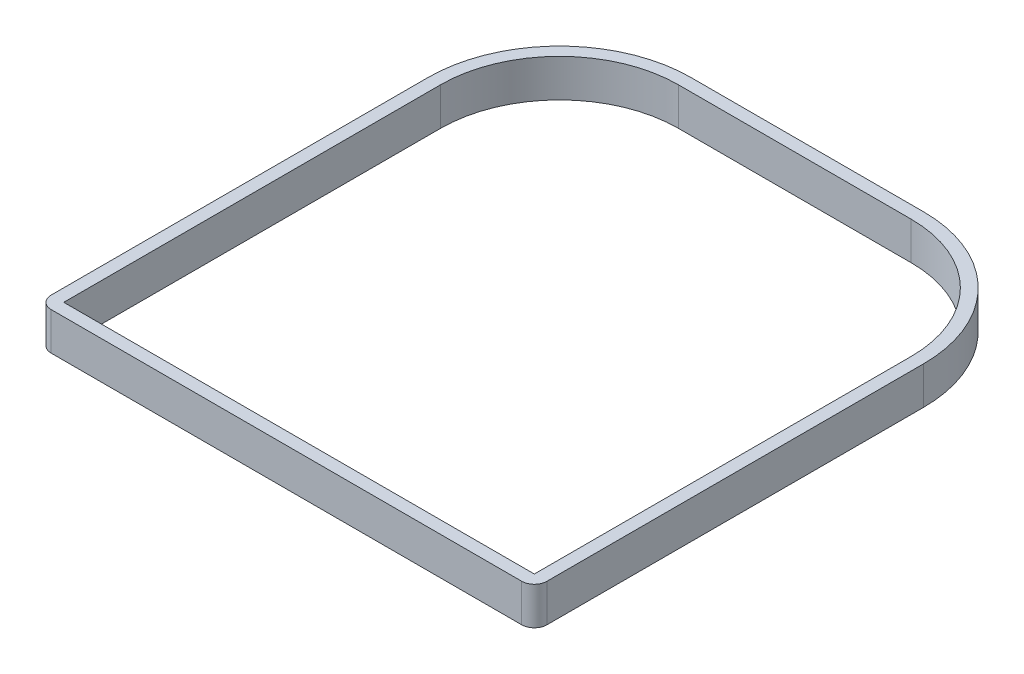
ISO-10303-21;
HEADER;
FILE_DESCRIPTION(('STEP AP214'),'2;1');
FILE_NAME('part.step','',(''),(''),'','','');
FILE_SCHEMA(('AUTOMOTIVE_DESIGN { 1 0 10303 214 1 1 1 1 }'));
ENDSEC;
DATA;
#1=APPLICATION_CONTEXT('core data for automotive mechanical design processes');
#2=APPLICATION_PROTOCOL_DEFINITION('international standard','automotive_design',2000,#1);
#3=PRODUCT_CONTEXT('',#1,'mechanical');
#4=PRODUCT('Part','Part','',(#3));
#5=PRODUCT_RELATED_PRODUCT_CATEGORY('part','',(#4));
#6=PRODUCT_DEFINITION_FORMATION('','',#4);
#7=PRODUCT_DEFINITION_CONTEXT('part definition',#1,'design');
#8=PRODUCT_DEFINITION('design','',#6,#7);
#9=PRODUCT_DEFINITION_SHAPE('','',#8);
#10=(LENGTH_UNIT() NAMED_UNIT(*) SI_UNIT(.MILLI.,.METRE.));
#11=(NAMED_UNIT(*) PLANE_ANGLE_UNIT() SI_UNIT($,.RADIAN.));
#12=(NAMED_UNIT(*) SI_UNIT($,.STERADIAN.) SOLID_ANGLE_UNIT());
#13=UNCERTAINTY_MEASURE_WITH_UNIT(LENGTH_MEASURE(1.E-05),#10,'distance_accuracy_value','');
#14=(GEOMETRIC_REPRESENTATION_CONTEXT(3) GLOBAL_UNCERTAINTY_ASSIGNED_CONTEXT((#13)) GLOBAL_UNIT_ASSIGNED_CONTEXT((#10,
#11,#12)) REPRESENTATION_CONTEXT('',''));
#15=CARTESIAN_POINT('',(0.,0.,0.));
#16=DIRECTION('',(0.,0.,1.));
#17=DIRECTION('',(1.,0.,0.));
#18=AXIS2_PLACEMENT_3D('',#15,#16,#17);
#19=CARTESIAN_POINT('',(-9.25,1.5,-9.25));
#20=DIRECTION('',(0.,1.,0.));
#21=DIRECTION('',(0.,0.,1.));
#22=AXIS2_PLACEMENT_3D('',#19,#20,#21);
#23=PLANE('',#22);
#24=DIRECTION('',(1.,0.,0.));
#25=VECTOR('',#24,1.);
#26=CARTESIAN_POINT('',(-19.7,1.5,21.7));
#27=LINE('',#26,#25);
#28=CARTESIAN_POINT('',(-18.7,1.5,21.7));
#29=VERTEX_POINT('',#28);
#30=CARTESIAN_POINT('',(18.7,1.5,21.7));
#31=VERTEX_POINT('',#30);
#32=EDGE_CURVE('E205',#29,#31,#27,.T.);
#33=ORIENTED_EDGE('',*,*,#32,.T.);
#34=CARTESIAN_POINT('',(18.7,1.5,20.7));
#35=DIRECTION('',(0.,1.,0.));
#36=DIRECTION('',(0.,0.,1.));
#37=AXIS2_PLACEMENT_3D('',#34,#35,#36);
#38=CIRCLE('',#37,1.);
#39=CARTESIAN_POINT('',(19.7,1.5,20.7));
#40=VERTEX_POINT('',#39);
#41=EDGE_CURVE('E48',#31,#40,#38,.T.);
#42=ORIENTED_EDGE('',*,*,#41,.T.);
#43=DIRECTION('',(0.,0.,-1.));
#44=VECTOR('',#43,1.);
#45=CARTESIAN_POINT('',(19.7,1.5,-9.25));
#46=LINE('',#45,#44);
#47=CARTESIAN_POINT('',(19.7,1.5,-9.25));
#48=VERTEX_POINT('',#47);
#49=EDGE_CURVE('E207',#40,#48,#46,.T.);
#50=ORIENTED_EDGE('',*,*,#49,.T.);
#51=CARTESIAN_POINT('',(9.25,1.5,-9.25));
#52=DIRECTION('',(0.,1.,0.));
#53=DIRECTION('',(0.,0.,1.));
#54=AXIS2_PLACEMENT_3D('',#51,#52,#53);
#55=CIRCLE('',#54,10.45);
#56=CARTESIAN_POINT('',(9.25,1.5,-19.7));
#57=VERTEX_POINT('',#56);
#58=EDGE_CURVE('E209',#48,#57,#55,.T.);
#59=ORIENTED_EDGE('',*,*,#58,.T.);
#60=DIRECTION('',(-1.,0.,0.));
#61=VECTOR('',#60,1.);
#62=CARTESIAN_POINT('',(-9.25,1.5,-19.7));
#63=LINE('',#62,#61);
#64=CARTESIAN_POINT('',(-9.25,1.5,-19.7));
#65=VERTEX_POINT('',#64);
#66=EDGE_CURVE('E211',#57,#65,#63,.T.);
#67=ORIENTED_EDGE('',*,*,#66,.T.);
#68=CARTESIAN_POINT('',(-9.25,1.5,-9.25));
#69=DIRECTION('',(0.,1.,0.));
#70=DIRECTION('',(0.,0.,1.));
#71=AXIS2_PLACEMENT_3D('',#68,#69,#70);
#72=CIRCLE('',#71,10.45);
#73=CARTESIAN_POINT('',(-19.7,1.5,-9.25));
#74=VERTEX_POINT('',#73);
#75=EDGE_CURVE('E199',#65,#74,#72,.T.);
#76=ORIENTED_EDGE('',*,*,#75,.T.);
#77=DIRECTION('',(0.,0.,1.));
#78=VECTOR('',#77,1.);
#79=CARTESIAN_POINT('',(-19.7,1.5,-9.25));
#80=LINE('',#79,#78);
#81=CARTESIAN_POINT('',(-19.7,1.5,20.7));
#82=VERTEX_POINT('',#81);
#83=EDGE_CURVE('E202',#74,#82,#80,.T.);
#84=ORIENTED_EDGE('',*,*,#83,.T.);
#85=CARTESIAN_POINT('',(-18.7,1.5,20.7));
#86=DIRECTION('',(0.,1.,0.));
#87=DIRECTION('',(0.,0.,1.));
#88=AXIS2_PLACEMENT_3D('',#85,#86,#87);
#89=CIRCLE('',#88,1.);
#90=EDGE_CURVE('E247',#82,#29,#89,.T.);
#91=ORIENTED_EDGE('',*,*,#90,.T.);
#92=EDGE_LOOP('',(#33,#42,#50,#59,#67,#76,#84,#91));
#93=FACE_BOUND('',#92,.T.);
#94=DIRECTION('',(0.,0.,1.));
#95=VECTOR('',#94,1.);
#96=CARTESIAN_POINT('',(-18.7,1.5,-9.25));
#97=LINE('',#96,#95);
#98=CARTESIAN_POINT('',(-18.7,1.5,-9.25));
#99=VERTEX_POINT('',#98);
#100=CARTESIAN_POINT('',(-18.7,1.5,20.7));
#101=VERTEX_POINT('',#100);
#102=EDGE_CURVE('E153',#99,#101,#97,.T.);
#103=ORIENTED_EDGE('',*,*,#102,.F.);
#104=CARTESIAN_POINT('',(-9.25,1.5,-9.25));
#105=DIRECTION('',(0.,1.,0.));
#106=DIRECTION('',(0.,0.,1.));
#107=AXIS2_PLACEMENT_3D('',#104,#105,#106);
#108=CIRCLE('',#107,9.45);
#109=CARTESIAN_POINT('',(-9.25,1.5,-18.7));
#110=VERTEX_POINT('',#109);
#111=EDGE_CURVE('E143',#110,#99,#108,.T.);
#112=ORIENTED_EDGE('',*,*,#111,.F.);
#113=DIRECTION('',(-1.,0.,0.));
#114=VECTOR('',#113,1.);
#115=CARTESIAN_POINT('',(-9.25,1.5,-18.7));
#116=LINE('',#115,#114);
#117=CARTESIAN_POINT('',(9.25,1.5,-18.7));
#118=VERTEX_POINT('',#117);
#119=EDGE_CURVE('E175',#118,#110,#116,.T.);
#120=ORIENTED_EDGE('',*,*,#119,.F.);
#121=CARTESIAN_POINT('',(9.25,1.5,-9.25));
#122=DIRECTION('',(0.,1.,0.));
#123=DIRECTION('',(0.,0.,1.));
#124=AXIS2_PLACEMENT_3D('',#121,#122,#123);
#125=CIRCLE('',#124,9.45);
#126=CARTESIAN_POINT('',(18.7,1.5,-9.25));
#127=VERTEX_POINT('',#126);
#128=EDGE_CURVE('E172',#127,#118,#125,.T.);
#129=ORIENTED_EDGE('',*,*,#128,.F.);
#130=DIRECTION('',(0.,0.,-1.));
#131=VECTOR('',#130,1.);
#132=CARTESIAN_POINT('',(18.7,1.5,-9.25));
#133=LINE('',#132,#131);
#134=CARTESIAN_POINT('',(18.7,1.5,20.7));
#135=VERTEX_POINT('',#134);
#136=EDGE_CURVE('E168',#135,#127,#133,.T.);
#137=ORIENTED_EDGE('',*,*,#136,.F.);
#138=DIRECTION('',(1.,0.,0.));
#139=VECTOR('',#138,1.);
#140=CARTESIAN_POINT('',(-18.7,1.5,20.7));
#141=LINE('',#140,#139);
#142=EDGE_CURVE('E166',#101,#135,#141,.T.);
#143=ORIENTED_EDGE('',*,*,#142,.F.);
#144=EDGE_LOOP('',(#103,#112,#120,#129,#137,#143));
#145=FACE_BOUND('',#144,.T.);
#146=ADVANCED_FACE('F40',(#93,#145),#23,.T.);
#147=CARTESIAN_POINT('',(-9.25,-1.5,-9.25));
#148=DIRECTION('',(0.,1.,0.));
#149=DIRECTION('',(0.,0.,1.));
#150=AXIS2_PLACEMENT_3D('',#147,#148,#149);
#151=PLANE('',#150);
#152=DIRECTION('',(0.,0.,-1.));
#153=VECTOR('',#152,1.);
#154=CARTESIAN_POINT('',(19.7,-1.5,-9.25));
#155=LINE('',#154,#153);
#156=CARTESIAN_POINT('',(19.7,-1.5,20.7));
#157=VERTEX_POINT('',#156);
#158=CARTESIAN_POINT('',(19.7,-1.5,-9.25));
#159=VERTEX_POINT('',#158);
#160=EDGE_CURVE('E220',#157,#159,#155,.T.);
#161=ORIENTED_EDGE('',*,*,#160,.F.);
#162=CARTESIAN_POINT('',(18.7,-1.5,20.7));
#163=DIRECTION('',(0.,1.,0.));
#164=DIRECTION('',(0.,0.,1.));
#165=AXIS2_PLACEMENT_3D('',#162,#163,#164);
#166=CIRCLE('',#165,1.);
#167=CARTESIAN_POINT('',(18.7,-1.5,21.7));
#168=VERTEX_POINT('',#167);
#169=EDGE_CURVE('E241',#157,#168,#166,.F.);
#170=ORIENTED_EDGE('',*,*,#169,.T.);
#171=DIRECTION('',(1.,0.,0.));
#172=VECTOR('',#171,1.);
#173=CARTESIAN_POINT('',(-19.7,-1.5,21.7));
#174=LINE('',#173,#172);
#175=CARTESIAN_POINT('',(-18.7,-1.5,21.7));
#176=VERTEX_POINT('',#175);
#177=EDGE_CURVE('E218',#176,#168,#174,.T.);
#178=ORIENTED_EDGE('',*,*,#177,.F.);
#179=CARTESIAN_POINT('',(-18.7,-1.5,20.7));
#180=DIRECTION('',(0.,1.,0.));
#181=DIRECTION('',(0.,0.,1.));
#182=AXIS2_PLACEMENT_3D('',#179,#180,#181);
#183=CIRCLE('',#182,1.);
#184=CARTESIAN_POINT('',(-19.7,-1.5,20.7));
#185=VERTEX_POINT('',#184);
#186=EDGE_CURVE('E239',#176,#185,#183,.F.);
#187=ORIENTED_EDGE('',*,*,#186,.T.);
#188=DIRECTION('',(0.,0.,1.));
#189=VECTOR('',#188,1.);
#190=CARTESIAN_POINT('',(-19.7,-1.5,-9.25));
#191=LINE('',#190,#189);
#192=CARTESIAN_POINT('',(-19.7,-1.5,-9.25));
#193=VERTEX_POINT('',#192);
#194=EDGE_CURVE('E216',#193,#185,#191,.T.);
#195=ORIENTED_EDGE('',*,*,#194,.F.);
#196=CARTESIAN_POINT('',(-9.25,-1.5,-9.25));
#197=DIRECTION('',(0.,1.,0.));
#198=DIRECTION('',(0.,0.,1.));
#199=AXIS2_PLACEMENT_3D('',#196,#197,#198);
#200=CIRCLE('',#199,10.45);
#201=CARTESIAN_POINT('',(-9.25,-1.5,-19.7));
#202=VERTEX_POINT('',#201);
#203=EDGE_CURVE('E161',#202,#193,#200,.T.);
#204=ORIENTED_EDGE('',*,*,#203,.F.);
#205=DIRECTION('',(-1.,0.,0.));
#206=VECTOR('',#205,1.);
#207=CARTESIAN_POINT('',(-9.25,-1.5,-19.7));
#208=LINE('',#207,#206);
#209=CARTESIAN_POINT('',(9.25,-1.5,-19.7));
#210=VERTEX_POINT('',#209);
#211=EDGE_CURVE('E203',#210,#202,#208,.T.);
#212=ORIENTED_EDGE('',*,*,#211,.F.);
#213=CARTESIAN_POINT('',(9.25,-1.5,-9.25));
#214=DIRECTION('',(0.,1.,0.));
#215=DIRECTION('',(0.,0.,1.));
#216=AXIS2_PLACEMENT_3D('',#213,#214,#215);
#217=CIRCLE('',#216,10.45);
#218=EDGE_CURVE('E222',#159,#210,#217,.T.);
#219=ORIENTED_EDGE('',*,*,#218,.F.);
#220=EDGE_LOOP('',(#161,#170,#178,#187,#195,#204,#212,#219));
#221=FACE_BOUND('',#220,.T.);
#222=CARTESIAN_POINT('',(-9.25,-1.5,-9.25));
#223=DIRECTION('',(0.,1.,0.));
#224=DIRECTION('',(0.,0.,1.));
#225=AXIS2_PLACEMENT_3D('',#222,#223,#224);
#226=CIRCLE('',#225,9.45);
#227=CARTESIAN_POINT('',(-9.25,-1.5,-18.7));
#228=VERTEX_POINT('',#227);
#229=CARTESIAN_POINT('',(-18.7,-1.5,-9.25));
#230=VERTEX_POINT('',#229);
#231=EDGE_CURVE('E177',#228,#230,#226,.T.);
#232=ORIENTED_EDGE('',*,*,#231,.T.);
#233=DIRECTION('',(0.,0.,1.));
#234=VECTOR('',#233,1.);
#235=CARTESIAN_POINT('',(-18.7,-1.5,-9.25));
#236=LINE('',#235,#234);
#237=CARTESIAN_POINT('',(-18.7,-1.5,20.7));
#238=VERTEX_POINT('',#237);
#239=EDGE_CURVE('E160',#230,#238,#236,.T.);
#240=ORIENTED_EDGE('',*,*,#239,.T.);
#241=DIRECTION('',(1.,0.,0.));
#242=VECTOR('',#241,1.);
#243=CARTESIAN_POINT('',(-18.7,-1.5,20.7));
#244=LINE('',#243,#242);
#245=CARTESIAN_POINT('',(18.7,-1.5,20.7));
#246=VERTEX_POINT('',#245);
#247=EDGE_CURVE('E180',#238,#246,#244,.T.);
#248=ORIENTED_EDGE('',*,*,#247,.T.);
#249=DIRECTION('',(0.,0.,-1.));
#250=VECTOR('',#249,1.);
#251=CARTESIAN_POINT('',(18.7,-1.5,-9.25));
#252=LINE('',#251,#250);
#253=CARTESIAN_POINT('',(18.7,-1.5,-9.25));
#254=VERTEX_POINT('',#253);
#255=EDGE_CURVE('E183',#246,#254,#252,.T.);
#256=ORIENTED_EDGE('',*,*,#255,.T.);
#257=CARTESIAN_POINT('',(9.25,-1.5,-9.25));
#258=DIRECTION('',(0.,1.,0.));
#259=DIRECTION('',(0.,0.,1.));
#260=AXIS2_PLACEMENT_3D('',#257,#258,#259);
#261=CIRCLE('',#260,9.45);
#262=CARTESIAN_POINT('',(9.25,-1.5,-18.7));
#263=VERTEX_POINT('',#262);
#264=EDGE_CURVE('E186',#254,#263,#261,.T.);
#265=ORIENTED_EDGE('',*,*,#264,.T.);
#266=DIRECTION('',(-1.,0.,0.));
#267=VECTOR('',#266,1.);
#268=CARTESIAN_POINT('',(-9.25,-1.5,-18.7));
#269=LINE('',#268,#267);
#270=EDGE_CURVE('E154',#263,#228,#269,.T.);
#271=ORIENTED_EDGE('',*,*,#270,.T.);
#272=EDGE_LOOP('',(#232,#240,#248,#256,#265,#271));
#273=FACE_BOUND('',#272,.T.);
#274=ADVANCED_FACE('F261',(#221,#273),#151,.F.);
#275=CARTESIAN_POINT('',(-9.25,1.5,-9.25));
#276=DIRECTION('',(0.,-1.,0.));
#277=DIRECTION('',(0.,0.,-1.));
#278=AXIS2_PLACEMENT_3D('',#275,#276,#277);
#279=CYLINDRICAL_SURFACE('',#278,10.45);
#280=ORIENTED_EDGE('',*,*,#203,.T.);
#281=DIRECTION('',(0.,-1.,0.));
#282=VECTOR('',#281,1.);
#283=CARTESIAN_POINT('',(-19.7,1.5,-9.25));
#284=LINE('',#283,#282);
#285=EDGE_CURVE('E233',#74,#193,#284,.T.);
#286=ORIENTED_EDGE('',*,*,#285,.F.);
#287=ORIENTED_EDGE('',*,*,#75,.F.);
#288=DIRECTION('',(0.,-1.,0.));
#289=VECTOR('',#288,1.);
#290=CARTESIAN_POINT('',(-9.25,1.5,-19.7));
#291=LINE('',#290,#289);
#292=EDGE_CURVE('E213',#65,#202,#291,.T.);
#293=ORIENTED_EDGE('',*,*,#292,.T.);
#294=EDGE_LOOP('',(#280,#286,#287,#293));
#295=FACE_BOUND('',#294,.T.);
#296=ADVANCED_FACE('F273',(#295),#279,.T.);
#297=CARTESIAN_POINT('',(-19.7,1.5,-9.25));
#298=DIRECTION('',(1.,0.,0.));
#299=DIRECTION('',(0.,0.,-1.));
#300=AXIS2_PLACEMENT_3D('',#297,#298,#299);
#301=PLANE('',#300);
#302=ORIENTED_EDGE('',*,*,#194,.T.);
#303=DIRECTION('',(0.,-1.,0.));
#304=VECTOR('',#303,1.);
#305=CARTESIAN_POINT('',(-19.7,1.5,20.7));
#306=LINE('',#305,#304);
#307=EDGE_CURVE('E11',#185,#82,#306,.F.);
#308=ORIENTED_EDGE('',*,*,#307,.T.);
#309=ORIENTED_EDGE('',*,*,#83,.F.);
#310=ORIENTED_EDGE('',*,*,#285,.T.);
#311=EDGE_LOOP('',(#302,#308,#309,#310));
#312=FACE_BOUND('',#311,.T.);
#313=ADVANCED_FACE('F269',(#312),#301,.F.);
#314=CARTESIAN_POINT('',(-19.7,1.5,21.7));
#315=DIRECTION('',(0.,0.,-1.));
#316=DIRECTION('',(-1.,0.,0.));
#317=AXIS2_PLACEMENT_3D('',#314,#315,#316);
#318=PLANE('',#317);
#319=ORIENTED_EDGE('',*,*,#177,.T.);
#320=DIRECTION('',(0.,-1.,0.));
#321=VECTOR('',#320,1.);
#322=CARTESIAN_POINT('',(18.7,1.5,21.7));
#323=LINE('',#322,#321);
#324=EDGE_CURVE('E61',#168,#31,#323,.F.);
#325=ORIENTED_EDGE('',*,*,#324,.T.);
#326=ORIENTED_EDGE('',*,*,#32,.F.);
#327=DIRECTION('',(0.,-1.,0.));
#328=VECTOR('',#327,1.);
#329=CARTESIAN_POINT('',(-18.7,1.5,21.7));
#330=LINE('',#329,#328);
#331=EDGE_CURVE('E243',#29,#176,#330,.T.);
#332=ORIENTED_EDGE('',*,*,#331,.T.);
#333=EDGE_LOOP('',(#319,#325,#326,#332));
#334=FACE_BOUND('',#333,.T.);
#335=ADVANCED_FACE('F264',(#334),#318,.F.);
#336=CARTESIAN_POINT('',(19.7,1.5,-9.25));
#337=DIRECTION('',(-1.,0.,0.));
#338=DIRECTION('',(0.,0.,1.));
#339=AXIS2_PLACEMENT_3D('',#336,#337,#338);
#340=PLANE('',#339);
#341=ORIENTED_EDGE('',*,*,#49,.F.);
#342=DIRECTION('',(0.,-1.,0.));
#343=VECTOR('',#342,1.);
#344=CARTESIAN_POINT('',(19.7,1.5,20.7));
#345=LINE('',#344,#343);
#346=EDGE_CURVE('E236',#40,#157,#345,.T.);
#347=ORIENTED_EDGE('',*,*,#346,.T.);
#348=ORIENTED_EDGE('',*,*,#160,.T.);
#349=DIRECTION('',(0.,-1.,0.));
#350=VECTOR('',#349,1.);
#351=CARTESIAN_POINT('',(19.7,1.5,-9.25));
#352=LINE('',#351,#350);
#353=EDGE_CURVE('E230',#48,#159,#352,.T.);
#354=ORIENTED_EDGE('',*,*,#353,.F.);
#355=EDGE_LOOP('',(#341,#347,#348,#354));
#356=FACE_BOUND('',#355,.T.);
#357=ADVANCED_FACE('F255',(#356),#340,.F.);
#358=CARTESIAN_POINT('',(9.25,1.5,-9.25));
#359=DIRECTION('',(0.,-1.,0.));
#360=DIRECTION('',(0.,0.,-1.));
#361=AXIS2_PLACEMENT_3D('',#358,#359,#360);
#362=CYLINDRICAL_SURFACE('',#361,10.45);
#363=ORIENTED_EDGE('',*,*,#218,.T.);
#364=DIRECTION('',(0.,-1.,0.));
#365=VECTOR('',#364,1.);
#366=CARTESIAN_POINT('',(9.25,1.5,-19.7));
#367=LINE('',#366,#365);
#368=EDGE_CURVE('E227',#57,#210,#367,.T.);
#369=ORIENTED_EDGE('',*,*,#368,.F.);
#370=ORIENTED_EDGE('',*,*,#58,.F.);
#371=ORIENTED_EDGE('',*,*,#353,.T.);
#372=EDGE_LOOP('',(#363,#369,#370,#371));
#373=FACE_BOUND('',#372,.T.);
#374=ADVANCED_FACE('F281',(#373),#362,.T.);
#375=CARTESIAN_POINT('',(-9.25,1.5,-19.7));
#376=DIRECTION('',(0.,0.,1.));
#377=DIRECTION('',(1.,0.,0.));
#378=AXIS2_PLACEMENT_3D('',#375,#376,#377);
#379=PLANE('',#378);
#380=ORIENTED_EDGE('',*,*,#211,.T.);
#381=ORIENTED_EDGE('',*,*,#292,.F.);
#382=ORIENTED_EDGE('',*,*,#66,.F.);
#383=ORIENTED_EDGE('',*,*,#368,.T.);
#384=EDGE_LOOP('',(#380,#381,#382,#383));
#385=FACE_BOUND('',#384,.T.);
#386=ADVANCED_FACE('F277',(#385),#379,.F.);
#387=CARTESIAN_POINT('',(-9.25,1.5,-9.25));
#388=DIRECTION('',(0.,-1.,0.));
#389=DIRECTION('',(0.,0.,-1.));
#390=AXIS2_PLACEMENT_3D('',#387,#388,#389);
#391=CYLINDRICAL_SURFACE('',#390,9.45);
#392=ORIENTED_EDGE('',*,*,#231,.F.);
#393=DIRECTION('',(0.,-1.,0.));
#394=VECTOR('',#393,1.);
#395=CARTESIAN_POINT('',(-9.25,1.5,-18.7));
#396=LINE('',#395,#394);
#397=EDGE_CURVE('E149',#110,#228,#396,.T.);
#398=ORIENTED_EDGE('',*,*,#397,.F.);
#399=ORIENTED_EDGE('',*,*,#111,.T.);
#400=DIRECTION('',(0.,-1.,0.));
#401=VECTOR('',#400,1.);
#402=CARTESIAN_POINT('',(-18.7,1.5,-9.25));
#403=LINE('',#402,#401);
#404=EDGE_CURVE('E146',#99,#230,#403,.T.);
#405=ORIENTED_EDGE('',*,*,#404,.T.);
#406=EDGE_LOOP('',(#392,#398,#399,#405));
#407=FACE_BOUND('',#406,.T.);
#408=ADVANCED_FACE('F145',(#407),#391,.F.);
#409=CARTESIAN_POINT('',(-18.7,1.5,-9.25));
#410=DIRECTION('',(1.,0.,0.));
#411=DIRECTION('',(0.,0.,-1.));
#412=AXIS2_PLACEMENT_3D('',#409,#410,#411);
#413=PLANE('',#412);
#414=ORIENTED_EDGE('',*,*,#239,.F.);
#415=ORIENTED_EDGE('',*,*,#404,.F.);
#416=ORIENTED_EDGE('',*,*,#102,.T.);
#417=DIRECTION('',(0.,-1.,0.));
#418=VECTOR('',#417,1.);
#419=CARTESIAN_POINT('',(-18.7,1.5,20.7));
#420=LINE('',#419,#418);
#421=EDGE_CURVE('E162',#101,#238,#420,.T.);
#422=ORIENTED_EDGE('',*,*,#421,.T.);
#423=EDGE_LOOP('',(#414,#415,#416,#422));
#424=FACE_BOUND('',#423,.T.);
#425=ADVANCED_FACE('F157',(#424),#413,.T.);
#426=CARTESIAN_POINT('',(-18.7,1.5,20.7));
#427=DIRECTION('',(0.,0.,-1.));
#428=DIRECTION('',(-1.,0.,0.));
#429=AXIS2_PLACEMENT_3D('',#426,#427,#428);
#430=PLANE('',#429);
#431=ORIENTED_EDGE('',*,*,#247,.F.);
#432=ORIENTED_EDGE('',*,*,#421,.F.);
#433=ORIENTED_EDGE('',*,*,#142,.T.);
#434=DIRECTION('',(0.,-1.,0.));
#435=VECTOR('',#434,1.);
#436=CARTESIAN_POINT('',(18.7,1.5,20.7));
#437=LINE('',#436,#435);
#438=EDGE_CURVE('E196',#135,#246,#437,.T.);
#439=ORIENTED_EDGE('',*,*,#438,.T.);
#440=EDGE_LOOP('',(#431,#432,#433,#439));
#441=FACE_BOUND('',#440,.T.);
#442=ADVANCED_FACE('F301',(#441),#430,.T.);
#443=CARTESIAN_POINT('',(18.7,1.5,-9.25));
#444=DIRECTION('',(-1.,0.,0.));
#445=DIRECTION('',(0.,0.,1.));
#446=AXIS2_PLACEMENT_3D('',#443,#444,#445);
#447=PLANE('',#446);
#448=ORIENTED_EDGE('',*,*,#255,.F.);
#449=ORIENTED_EDGE('',*,*,#438,.F.);
#450=ORIENTED_EDGE('',*,*,#136,.T.);
#451=DIRECTION('',(0.,-1.,0.));
#452=VECTOR('',#451,1.);
#453=CARTESIAN_POINT('',(18.7,1.5,-9.25));
#454=LINE('',#453,#452);
#455=EDGE_CURVE('E194',#127,#254,#454,.T.);
#456=ORIENTED_EDGE('',*,*,#455,.T.);
#457=EDGE_LOOP('',(#448,#449,#450,#456));
#458=FACE_BOUND('',#457,.T.);
#459=ADVANCED_FACE('F304',(#458),#447,.T.);
#460=CARTESIAN_POINT('',(9.25,1.5,-9.25));
#461=DIRECTION('',(0.,-1.,0.));
#462=DIRECTION('',(0.,0.,-1.));
#463=AXIS2_PLACEMENT_3D('',#460,#461,#462);
#464=CYLINDRICAL_SURFACE('',#463,9.45);
#465=ORIENTED_EDGE('',*,*,#264,.F.);
#466=ORIENTED_EDGE('',*,*,#455,.F.);
#467=ORIENTED_EDGE('',*,*,#128,.T.);
#468=DIRECTION('',(0.,-1.,0.));
#469=VECTOR('',#468,1.);
#470=CARTESIAN_POINT('',(9.25,1.5,-18.7));
#471=LINE('',#470,#469);
#472=EDGE_CURVE('E192',#118,#263,#471,.T.);
#473=ORIENTED_EDGE('',*,*,#472,.T.);
#474=EDGE_LOOP('',(#465,#466,#467,#473));
#475=FACE_BOUND('',#474,.T.);
#476=ADVANCED_FACE('F308',(#475),#464,.F.);
#477=CARTESIAN_POINT('',(-9.25,1.5,-18.7));
#478=DIRECTION('',(0.,0.,1.));
#479=DIRECTION('',(1.,0.,0.));
#480=AXIS2_PLACEMENT_3D('',#477,#478,#479);
#481=PLANE('',#480);
#482=ORIENTED_EDGE('',*,*,#270,.F.);
#483=ORIENTED_EDGE('',*,*,#472,.F.);
#484=ORIENTED_EDGE('',*,*,#119,.T.);
#485=ORIENTED_EDGE('',*,*,#397,.T.);
#486=EDGE_LOOP('',(#482,#483,#484,#485));
#487=FACE_BOUND('',#486,.T.);
#488=ADVANCED_FACE('F312',(#487),#481,.T.);
#489=CARTESIAN_POINT('',(18.7,1.5,20.7));
#490=DIRECTION('',(0.,-1.,0.));
#491=DIRECTION('',(0.,0.,-1.));
#492=AXIS2_PLACEMENT_3D('',#489,#490,#491);
#493=CYLINDRICAL_SURFACE('',#492,1.);
#494=ORIENTED_EDGE('',*,*,#41,.F.);
#495=ORIENTED_EDGE('',*,*,#324,.F.);
#496=ORIENTED_EDGE('',*,*,#169,.F.);
#497=ORIENTED_EDGE('',*,*,#346,.F.);
#498=EDGE_LOOP('',(#494,#495,#496,#497));
#499=FACE_BOUND('',#498,.T.);
#500=ADVANCED_FACE('F258',(#499),#493,.T.);
#501=CARTESIAN_POINT('',(-18.7,1.5,20.7));
#502=DIRECTION('',(0.,-1.,0.));
#503=DIRECTION('',(0.,0.,-1.));
#504=AXIS2_PLACEMENT_3D('',#501,#502,#503);
#505=CYLINDRICAL_SURFACE('',#504,1.);
#506=ORIENTED_EDGE('',*,*,#90,.F.);
#507=ORIENTED_EDGE('',*,*,#307,.F.);
#508=ORIENTED_EDGE('',*,*,#186,.F.);
#509=ORIENTED_EDGE('',*,*,#331,.F.);
#510=EDGE_LOOP('',(#506,#507,#508,#509));
#511=FACE_BOUND('',#510,.T.);
#512=ADVANCED_FACE('F42',(#511),#505,.T.);
#513=CLOSED_SHELL('',(#146,#274,#296,#313,#335,#357,#374,#386,#408,#425,#442,#459,#476,#488,
#500,#512));
#514=MANIFOLD_SOLID_BREP('B2',#513);
#515=ADVANCED_BREP_SHAPE_REPRESENTATION('',(#18,#514),#14);
#516=SHAPE_DEFINITION_REPRESENTATION(#9,#515);
ENDSEC;
END-ISO-10303-21;
